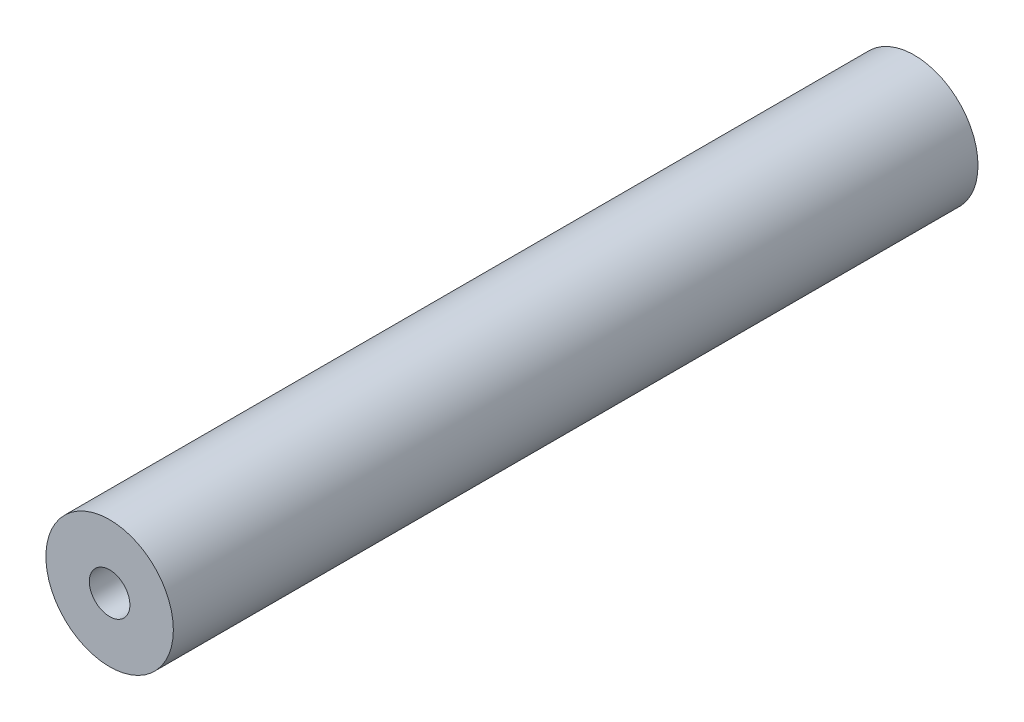
ISO-10303-21;
HEADER;
FILE_DESCRIPTION(('STEP AP214'),'2;1');
FILE_NAME('part.step','',(''),(''),'','','');
FILE_SCHEMA(('AUTOMOTIVE_DESIGN { 1 0 10303 214 1 1 1 1 }'));
ENDSEC;
DATA;
#1=APPLICATION_CONTEXT('core data for automotive mechanical design processes');
#2=APPLICATION_PROTOCOL_DEFINITION('international standard','automotive_design',2000,#1);
#3=PRODUCT_CONTEXT('',#1,'mechanical');
#4=PRODUCT('Part','Part','',(#3));
#5=PRODUCT_RELATED_PRODUCT_CATEGORY('part','',(#4));
#6=PRODUCT_DEFINITION_FORMATION('','',#4);
#7=PRODUCT_DEFINITION_CONTEXT('part definition',#1,'design');
#8=PRODUCT_DEFINITION('design','',#6,#7);
#9=PRODUCT_DEFINITION_SHAPE('','',#8);
#10=(LENGTH_UNIT() NAMED_UNIT(*) SI_UNIT(.MILLI.,.METRE.));
#11=(NAMED_UNIT(*) PLANE_ANGLE_UNIT() SI_UNIT($,.RADIAN.));
#12=(NAMED_UNIT(*) SI_UNIT($,.STERADIAN.) SOLID_ANGLE_UNIT());
#13=UNCERTAINTY_MEASURE_WITH_UNIT(LENGTH_MEASURE(1.E-05),#10,'distance_accuracy_value','');
#14=(GEOMETRIC_REPRESENTATION_CONTEXT(3) GLOBAL_UNCERTAINTY_ASSIGNED_CONTEXT((#13)) GLOBAL_UNIT_ASSIGNED_CONTEXT((#10,
#11,#12)) REPRESENTATION_CONTEXT('',''));
#15=CARTESIAN_POINT('',(0.,0.,0.));
#16=DIRECTION('',(0.,0.,1.));
#17=DIRECTION('',(1.,0.,0.));
#18=AXIS2_PLACEMENT_3D('',#15,#16,#17);
#19=CARTESIAN_POINT('',(0.,0.,40.08501));
#20=DIRECTION('',(0.,0.,-1.));
#21=DIRECTION('',(-1.,0.,0.));
#22=AXIS2_PLACEMENT_3D('',#19,#20,#21);
#23=CYLINDRICAL_SURFACE('',#22,6.35);
#24=CARTESIAN_POINT('',(0.,0.,40.08501));
#25=DIRECTION('',(0.,0.,1.));
#26=DIRECTION('',(1.,0.,0.));
#27=AXIS2_PLACEMENT_3D('',#24,#25,#26);
#28=CIRCLE('',#27,6.35);
#29=CARTESIAN_POINT('',(6.35,0.,40.08501));
#30=VERTEX_POINT('',#29);
#31=EDGE_CURVE('E11',#30,#30,#28,.T.);
#32=ORIENTED_EDGE('',*,*,#31,.F.);
#33=EDGE_LOOP('',(#32));
#34=FACE_BOUND('',#33,.T.);
#35=CARTESIAN_POINT('',(0.,0.,-40.08501));
#36=DIRECTION('',(0.,0.,1.));
#37=DIRECTION('',(1.,0.,0.));
#38=AXIS2_PLACEMENT_3D('',#35,#36,#37);
#39=CIRCLE('',#38,6.35);
#40=CARTESIAN_POINT('',(6.35,0.,-40.08501));
#41=VERTEX_POINT('',#40);
#42=EDGE_CURVE('E56',#41,#41,#39,.T.);
#43=ORIENTED_EDGE('',*,*,#42,.T.);
#44=EDGE_LOOP('',(#43));
#45=FACE_BOUND('',#44,.T.);
#46=ADVANCED_FACE('F53',(#34,#45),#23,.T.);
#47=CARTESIAN_POINT('',(0.,0.,40.08501));
#48=DIRECTION('',(0.,0.,1.));
#49=DIRECTION('',(1.,0.,0.));
#50=AXIS2_PLACEMENT_3D('',#47,#48,#49);
#51=PLANE('',#50);
#52=CARTESIAN_POINT('',(0.,0.,40.08501));
#53=DIRECTION('',(0.,0.,1.));
#54=DIRECTION('',(1.,0.,0.));
#55=AXIS2_PLACEMENT_3D('',#52,#53,#54);
#56=CIRCLE('',#55,2.01929999999999);
#57=CARTESIAN_POINT('',(2.01929999999999,0.,40.08501));
#58=VERTEX_POINT('',#57);
#59=EDGE_CURVE('E76',#58,#58,#56,.T.);
#60=ORIENTED_EDGE('',*,*,#59,.F.);
#61=EDGE_LOOP('',(#60));
#62=FACE_BOUND('',#61,.T.);
#63=ORIENTED_EDGE('',*,*,#31,.T.);
#64=EDGE_LOOP('',(#63));
#65=FACE_BOUND('',#64,.T.);
#66=ADVANCED_FACE('F95',(#62,#65),#51,.T.);
#67=CARTESIAN_POINT('',(0.,0.,-40.08501));
#68=DIRECTION('',(0.,0.,1.));
#69=DIRECTION('',(1.,0.,0.));
#70=AXIS2_PLACEMENT_3D('',#67,#68,#69);
#71=PLANE('',#70);
#72=CARTESIAN_POINT('',(0.,0.,-40.08501));
#73=DIRECTION('',(0.,0.,-1.));
#74=DIRECTION('',(-1.,0.,0.));
#75=AXIS2_PLACEMENT_3D('',#72,#73,#74);
#76=CIRCLE('',#75,2.01929999999999);
#77=CARTESIAN_POINT('',(-2.01929999999999,0.,-40.08501));
#78=VERTEX_POINT('',#77);
#79=EDGE_CURVE('E77',#78,#78,#76,.T.);
#80=ORIENTED_EDGE('',*,*,#79,.F.);
#81=EDGE_LOOP('',(#80));
#82=FACE_BOUND('',#81,.T.);
#83=ORIENTED_EDGE('',*,*,#42,.F.);
#84=EDGE_LOOP('',(#83));
#85=FACE_BOUND('',#84,.T.);
#86=ADVANCED_FACE('F92',(#82,#85),#71,.F.);
#87=CARTESIAN_POINT('',(0.,0.,28.05557));
#88=DIRECTION('',(0.,0.,1.));
#89=DIRECTION('',(1.,0.,0.));
#90=AXIS2_PLACEMENT_3D('',#87,#88,#89);
#91=CONICAL_SURFACE('',#90,2.01929999999999,1.02974425867665);
#92=CARTESIAN_POINT('',(0.,0.,26.8422521519976));
#93=VERTEX_POINT('',#92);
#94=VERTEX_LOOP('',#93);
#95=FACE_BOUND('',#94,.T.);
#96=CARTESIAN_POINT('',(0.,0.,28.05557));
#97=DIRECTION('',(0.,0.,1.));
#98=DIRECTION('',(1.,0.,0.));
#99=AXIS2_PLACEMENT_3D('',#96,#97,#98);
#100=CIRCLE('',#99,2.01929999999999);
#101=CARTESIAN_POINT('',(2.01929999999999,0.,28.05557));
#102=VERTEX_POINT('',#101);
#103=EDGE_CURVE('E80',#102,#102,#100,.T.);
#104=ORIENTED_EDGE('',*,*,#103,.T.);
#105=EDGE_LOOP('',(#104));
#106=FACE_BOUND('',#105,.T.);
#107=ADVANCED_FACE('F94',(#95,#106),#91,.F.);
#108=CARTESIAN_POINT('',(0.,0.,40.08501));
#109=DIRECTION('',(0.,0.,1.));
#110=DIRECTION('',(1.,0.,0.));
#111=AXIS2_PLACEMENT_3D('',#108,#109,#110);
#112=CYLINDRICAL_SURFACE('',#111,2.01929999999999);
#113=ORIENTED_EDGE('',*,*,#103,.F.);
#114=EDGE_LOOP('',(#113));
#115=FACE_BOUND('',#114,.T.);
#116=ORIENTED_EDGE('',*,*,#59,.T.);
#117=EDGE_LOOP('',(#116));
#118=FACE_BOUND('',#117,.T.);
#119=ADVANCED_FACE('F70',(#115,#118),#112,.F.);
#120=CARTESIAN_POINT('',(0.,0.,-28.05557));
#121=DIRECTION('',(0.,0.,-1.));
#122=DIRECTION('',(-1.,0.,0.));
#123=AXIS2_PLACEMENT_3D('',#120,#121,#122);
#124=CONICAL_SURFACE('',#123,2.01929999999999,1.02974425867665);
#125=CARTESIAN_POINT('',(0.,0.,-26.8422521519976));
#126=VERTEX_POINT('',#125);
#127=VERTEX_LOOP('',#126);
#128=FACE_BOUND('',#127,.T.);
#129=CARTESIAN_POINT('',(0.,0.,-28.05557));
#130=DIRECTION('',(0.,0.,-1.));
#131=DIRECTION('',(-1.,0.,0.));
#132=AXIS2_PLACEMENT_3D('',#129,#130,#131);
#133=CIRCLE('',#132,2.01929999999999);
#134=CARTESIAN_POINT('',(-2.01929999999999,0.,-28.05557));
#135=VERTEX_POINT('',#134);
#136=EDGE_CURVE('E74',#135,#135,#133,.T.);
#137=ORIENTED_EDGE('',*,*,#136,.T.);
#138=EDGE_LOOP('',(#137));
#139=FACE_BOUND('',#138,.T.);
#140=ADVANCED_FACE('F66',(#128,#139),#124,.F.);
#141=CARTESIAN_POINT('',(0.,0.,-40.08501));
#142=DIRECTION('',(0.,0.,-1.));
#143=DIRECTION('',(-1.,0.,0.));
#144=AXIS2_PLACEMENT_3D('',#141,#142,#143);
#145=CYLINDRICAL_SURFACE('',#144,2.01929999999999);
#146=ORIENTED_EDGE('',*,*,#136,.F.);
#147=EDGE_LOOP('',(#146));
#148=FACE_BOUND('',#147,.T.);
#149=ORIENTED_EDGE('',*,*,#79,.T.);
#150=EDGE_LOOP('',(#149));
#151=FACE_BOUND('',#150,.T.);
#152=ADVANCED_FACE('F69',(#148,#151),#145,.F.);
#153=CLOSED_SHELL('',(#46,#66,#86,#107,#119,#140,#152));
#154=MANIFOLD_SOLID_BREP('B2',#153);
#155=ADVANCED_BREP_SHAPE_REPRESENTATION('',(#18,#154),#14);
#156=SHAPE_DEFINITION_REPRESENTATION(#9,#155);
ENDSEC;
END-ISO-10303-21;
